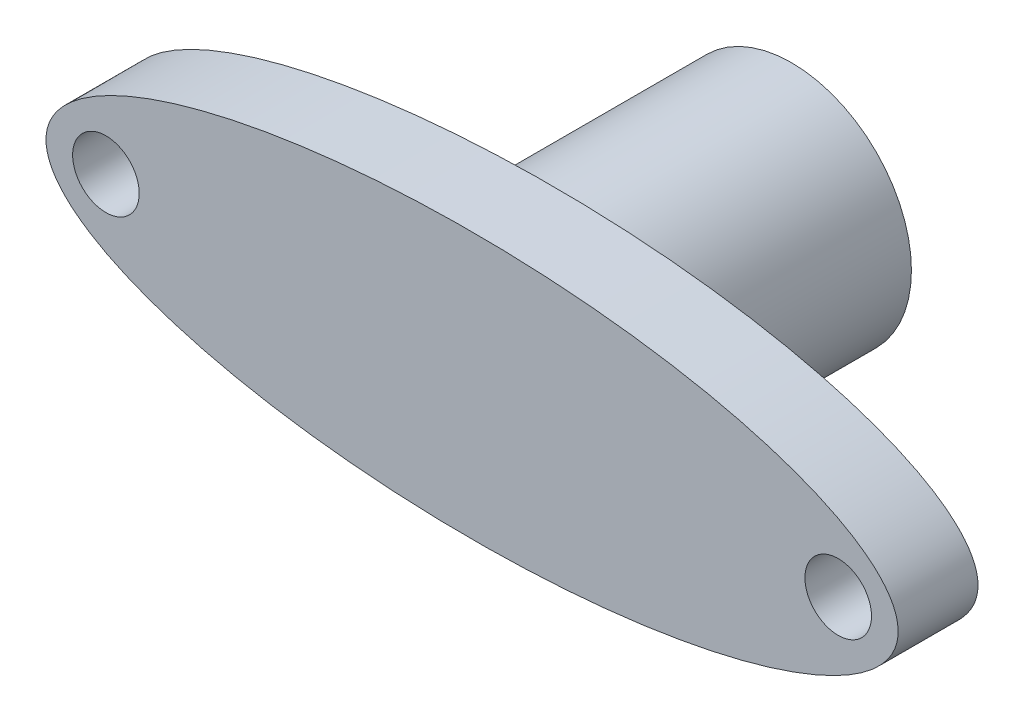
ISO-10303-21;
HEADER;
FILE_DESCRIPTION(('STEP AP214'),'2;1');
FILE_NAME('part.step','',(''),(''),'','','');
FILE_SCHEMA(('AUTOMOTIVE_DESIGN { 1 0 10303 214 1 1 1 1 }'));
ENDSEC;
DATA;
#1=APPLICATION_CONTEXT('core data for automotive mechanical design processes');
#2=APPLICATION_PROTOCOL_DEFINITION('international standard','automotive_design',2000,#1);
#3=PRODUCT_CONTEXT('',#1,'mechanical');
#4=PRODUCT('Part','Part','',(#3));
#5=PRODUCT_RELATED_PRODUCT_CATEGORY('part','',(#4));
#6=PRODUCT_DEFINITION_FORMATION('','',#4);
#7=PRODUCT_DEFINITION_CONTEXT('part definition',#1,'design');
#8=PRODUCT_DEFINITION('design','',#6,#7);
#9=PRODUCT_DEFINITION_SHAPE('','',#8);
#10=(LENGTH_UNIT() NAMED_UNIT(*) SI_UNIT(.MILLI.,.METRE.));
#11=(NAMED_UNIT(*) PLANE_ANGLE_UNIT() SI_UNIT($,.RADIAN.));
#12=(NAMED_UNIT(*) SI_UNIT($,.STERADIAN.) SOLID_ANGLE_UNIT());
#13=UNCERTAINTY_MEASURE_WITH_UNIT(LENGTH_MEASURE(1.E-05),#10,'distance_accuracy_value','');
#14=(GEOMETRIC_REPRESENTATION_CONTEXT(3) GLOBAL_UNCERTAINTY_ASSIGNED_CONTEXT((#13)) GLOBAL_UNIT_ASSIGNED_CONTEXT((#10,
#11,#12)) REPRESENTATION_CONTEXT('',''));
#15=CARTESIAN_POINT('',(0.,0.,0.));
#16=DIRECTION('',(0.,0.,1.));
#17=DIRECTION('',(1.,0.,0.));
#18=AXIS2_PLACEMENT_3D('',#15,#16,#17);
#19=CARTESIAN_POINT('',(-931.832148187907,736.166079396278,0.));
#20=DIRECTION('',(0.,0.,1.));
#21=DIRECTION('',(1.,0.,0.));
#22=AXIS2_PLACEMENT_3D('',#19,#20,#21);
#23=PLANE('',#22);
#24=CARTESIAN_POINT('',(-931.832148187907,736.166079396278,0.));
#25=DIRECTION('',(0.,0.,1.));
#26=DIRECTION('',(1.,0.,0.));
#27=AXIS2_PLACEMENT_3D('',#24,#25,#26);
#28=CIRCLE('',#27,225.);
#29=CARTESIAN_POINT('',(-706.832148187907,736.166079396278,0.));
#30=VERTEX_POINT('',#29);
#31=EDGE_CURVE('E12',#30,#30,#28,.F.);
#32=ORIENTED_EDGE('',*,*,#31,.F.);
#33=EDGE_LOOP('',(#32));
#34=FACE_BOUND('',#33,.T.);
#35=CARTESIAN_POINT('',(-244.332148187907,736.166079396278,0.));
#36=DIRECTION('',(0.,0.,1.));
#37=DIRECTION('',(1.,0.,0.));
#38=AXIS2_PLACEMENT_3D('',#35,#36,#37);
#39=CIRCLE('',#38,62.5);
#40=CARTESIAN_POINT('',(-181.832148187907,736.166079396278,0.));
#41=VERTEX_POINT('',#40);
#42=EDGE_CURVE('E163',#41,#41,#39,.T.);
#43=ORIENTED_EDGE('',*,*,#42,.T.);
#44=EDGE_LOOP('',(#43));
#45=FACE_BOUND('',#44,.T.);
#46=CARTESIAN_POINT('',(-1619.33214818791,736.166079396278,0.));
#47=DIRECTION('',(0.,0.,1.));
#48=DIRECTION('',(1.,0.,0.));
#49=AXIS2_PLACEMENT_3D('',#46,#47,#48);
#50=CIRCLE('',#49,62.5);
#51=CARTESIAN_POINT('',(-1556.83214818791,736.166079396278,0.));
#52=VERTEX_POINT('',#51);
#53=EDGE_CURVE('E169',#52,#52,#50,.T.);
#54=ORIENTED_EDGE('',*,*,#53,.T.);
#55=EDGE_LOOP('',(#54));
#56=FACE_BOUND('',#55,.T.);
#57=CARTESIAN_POINT('',(-931.832148187907,736.166079396278,0.));
#58=DIRECTION('',(0.,0.,1.));
#59=DIRECTION('',(1.,0.,0.));
#60=AXIS2_PLACEMENT_3D('',#57,#58,#59);
#61=ELLIPSE('',#60,800.,250.);
#62=CARTESIAN_POINT('',(-131.832148187907,736.166079396278,0.));
#63=VERTEX_POINT('',#62);
#64=EDGE_CURVE('E172',#63,#63,#61,.T.);
#65=ORIENTED_EDGE('',*,*,#64,.F.);
#66=EDGE_LOOP('',(#65));
#67=FACE_BOUND('',#66,.T.);
#68=ADVANCED_FACE('F52',(#34,#45,#56,#67),#23,.F.);
#69=CARTESIAN_POINT('',(-931.832148187907,736.166079396278,150.));
#70=DIRECTION('',(0.,0.,1.));
#71=DIRECTION('',(1.,0.,0.));
#72=AXIS2_PLACEMENT_3D('',#69,#70,#71);
#73=PLANE('',#72);
#74=CARTESIAN_POINT('',(-1619.33214818791,736.166079396278,150.));
#75=DIRECTION('',(0.,0.,1.));
#76=DIRECTION('',(1.,0.,0.));
#77=AXIS2_PLACEMENT_3D('',#74,#75,#76);
#78=CIRCLE('',#77,62.5);
#79=CARTESIAN_POINT('',(-1556.83214818791,736.166079396278,150.));
#80=VERTEX_POINT('',#79);
#81=EDGE_CURVE('E173',#80,#80,#78,.T.);
#82=ORIENTED_EDGE('',*,*,#81,.F.);
#83=EDGE_LOOP('',(#82));
#84=FACE_BOUND('',#83,.T.);
#85=CARTESIAN_POINT('',(-931.832148187907,736.166079396278,150.));
#86=DIRECTION('',(0.,0.,1.));
#87=DIRECTION('',(1.,0.,0.));
#88=AXIS2_PLACEMENT_3D('',#85,#86,#87);
#89=ELLIPSE('',#88,800.,250.);
#90=CARTESIAN_POINT('',(-131.832148187907,736.166079396278,150.));
#91=VERTEX_POINT('',#90);
#92=EDGE_CURVE('E65',#91,#91,#89,.T.);
#93=ORIENTED_EDGE('',*,*,#92,.T.);
#94=EDGE_LOOP('',(#93));
#95=FACE_BOUND('',#94,.T.);
#96=CARTESIAN_POINT('',(-244.332148187907,736.166079396278,150.));
#97=DIRECTION('',(0.,0.,1.));
#98=DIRECTION('',(1.,0.,0.));
#99=AXIS2_PLACEMENT_3D('',#96,#97,#98);
#100=CIRCLE('',#99,62.5);
#101=CARTESIAN_POINT('',(-181.832148187907,736.166079396278,150.));
#102=VERTEX_POINT('',#101);
#103=EDGE_CURVE('E164',#102,#102,#100,.T.);
#104=ORIENTED_EDGE('',*,*,#103,.F.);
#105=EDGE_LOOP('',(#104));
#106=FACE_BOUND('',#105,.T.);
#107=ADVANCED_FACE('F181',(#84,#95,#106),#73,.T.);
#108=DIRECTION('',(0.,0.,-1.));
#109=VECTOR('',#108,1.);
#110=SURFACE_OF_LINEAR_EXTRUSION('',#89,#109);
#111=ORIENTED_EDGE('',*,*,#92,.F.);
#112=EDGE_LOOP('',(#111));
#113=FACE_BOUND('',#112,.T.);
#114=ORIENTED_EDGE('',*,*,#64,.T.);
#115=EDGE_LOOP('',(#114));
#116=FACE_BOUND('',#115,.T.);
#117=ADVANCED_FACE('F54',(#113,#116),#110,.F.);
#118=CARTESIAN_POINT('',(-1619.33214818791,736.166079396278,150.));
#119=DIRECTION('',(0.,0.,-1.));
#120=DIRECTION('',(-1.,0.,0.));
#121=AXIS2_PLACEMENT_3D('',#118,#119,#120);
#122=CYLINDRICAL_SURFACE('',#121,62.5);
#123=ORIENTED_EDGE('',*,*,#81,.T.);
#124=EDGE_LOOP('',(#123));
#125=FACE_BOUND('',#124,.T.);
#126=ORIENTED_EDGE('',*,*,#53,.F.);
#127=EDGE_LOOP('',(#126));
#128=FACE_BOUND('',#127,.T.);
#129=ADVANCED_FACE('F193',(#125,#128),#122,.F.);
#130=CARTESIAN_POINT('',(-244.332148187907,736.166079396278,150.));
#131=DIRECTION('',(0.,0.,-1.));
#132=DIRECTION('',(-1.,0.,0.));
#133=AXIS2_PLACEMENT_3D('',#130,#131,#132);
#134=CYLINDRICAL_SURFACE('',#133,62.5);
#135=ORIENTED_EDGE('',*,*,#103,.T.);
#136=EDGE_LOOP('',(#135));
#137=FACE_BOUND('',#136,.T.);
#138=ORIENTED_EDGE('',*,*,#42,.F.);
#139=EDGE_LOOP('',(#138));
#140=FACE_BOUND('',#139,.T.);
#141=ADVANCED_FACE('F196',(#137,#140),#134,.F.);
#142=CARTESIAN_POINT('',(-872.915714979078,633.728792189088,-450.));
#143=DIRECTION('',(0.00165450604300018,0.99999863130394,0.));
#144=DIRECTION('',(-0.99999863130394,0.00165450604300018,0.));
#145=AXIS2_PLACEMENT_3D('',#142,#143,#144);
#146=PLANE('',#145);
#147=DIRECTION('',(-0.99999863130394,0.0016545060429936,0.));
#148=VECTOR('',#147,1.);
#149=CARTESIAN_POINT('',(-872.915714979077,633.728792189089,-150.));
#150=LINE('',#149,#148);
#151=CARTESIAN_POINT('',(-872.915714979077,633.728792189089,-150.));
#152=VERTEX_POINT('',#151);
#153=CARTESIAN_POINT('',(-991.087224599681,633.924307933468,-150.));
#154=VERTEX_POINT('',#153);
#155=EDGE_CURVE('E149',#152,#154,#150,.T.);
#156=ORIENTED_EDGE('',*,*,#155,.F.);
#157=DIRECTION('',(0.,0.,1.));
#158=VECTOR('',#157,1.);
#159=CARTESIAN_POINT('',(-872.915714979078,633.728792189088,-450.));
#160=LINE('',#159,#158);
#161=CARTESIAN_POINT('',(-872.915714979078,633.728792189088,-450.));
#162=VERTEX_POINT('',#161);
#163=EDGE_CURVE('E66',#162,#152,#160,.T.);
#164=ORIENTED_EDGE('',*,*,#163,.F.);
#165=DIRECTION('',(-0.99999863130394,0.00165450604300018,0.));
#166=VECTOR('',#165,1.);
#167=CARTESIAN_POINT('',(-872.915714979078,633.728792189088,-450.));
#168=LINE('',#167,#166);
#169=CARTESIAN_POINT('',(-991.087224599681,633.924307933468,-450.));
#170=VERTEX_POINT('',#169);
#171=EDGE_CURVE('E107',#162,#170,#168,.T.);
#172=ORIENTED_EDGE('',*,*,#171,.T.);
#173=DIRECTION('',(0.,0.,1.));
#174=VECTOR('',#173,1.);
#175=CARTESIAN_POINT('',(-991.087224599681,633.924307933468,-450.));
#176=LINE('',#175,#174);
#177=EDGE_CURVE('E109',#170,#154,#176,.T.);
#178=ORIENTED_EDGE('',*,*,#177,.T.);
#179=EDGE_LOOP('',(#156,#164,#172,#178));
#180=FACE_BOUND('',#179,.T.);
#181=ADVANCED_FACE('F108',(#180),#146,.T.);
#182=CARTESIAN_POINT('',(-991.087224599681,633.924307933468,-450.));
#183=DIRECTION('',(0.866851471480381,0.498566471388017,0.));
#184=DIRECTION('',(-0.498566471388017,0.866851471480381,0.));
#185=AXIS2_PLACEMENT_3D('',#182,#183,#184);
#186=PLANE('',#185);
#187=DIRECTION('',(-0.498566471388022,0.866851471480378,0.));
#188=VECTOR('',#187,1.);
#189=CARTESIAN_POINT('',(-991.08722459968,633.924307933467,-150.));
#190=LINE('',#189,#188);
#191=CARTESIAN_POINT('',(-1050.00365780851,736.361595140657,-150.));
#192=VERTEX_POINT('',#191);
#193=EDGE_CURVE('E80',#154,#192,#190,.T.);
#194=ORIENTED_EDGE('',*,*,#193,.F.);
#195=ORIENTED_EDGE('',*,*,#177,.F.);
#196=DIRECTION('',(-0.498566471388017,0.866851471480381,0.));
#197=VECTOR('',#196,1.);
#198=CARTESIAN_POINT('',(-991.087224599681,633.924307933468,-450.));
#199=LINE('',#198,#197);
#200=CARTESIAN_POINT('',(-1050.00365780851,736.361595140657,-450.));
#201=VERTEX_POINT('',#200);
#202=EDGE_CURVE('E113',#170,#201,#199,.T.);
#203=ORIENTED_EDGE('',*,*,#202,.T.);
#204=DIRECTION('',(0.,0.,1.));
#205=VECTOR('',#204,1.);
#206=CARTESIAN_POINT('',(-1050.00365780851,736.361595140657,-450.));
#207=LINE('',#206,#205);
#208=EDGE_CURVE('E119',#201,#192,#207,.T.);
#209=ORIENTED_EDGE('',*,*,#208,.T.);
#210=EDGE_LOOP('',(#194,#195,#203,#209));
#211=FACE_BOUND('',#210,.T.);
#212=ADVANCED_FACE('F120',(#211),#186,.T.);
#213=CARTESIAN_POINT('',(-1050.00365780851,736.361595140657,-450.));
#214=DIRECTION('',(0.865196965437382,-0.501432159915921,0.));
#215=DIRECTION('',(0.501432159915921,0.865196965437382,0.));
#216=AXIS2_PLACEMENT_3D('',#213,#214,#215);
#217=PLANE('',#216);
#218=DIRECTION('',(0.501432159915916,0.865196965437385,0.));
#219=VECTOR('',#218,1.);
#220=CARTESIAN_POINT('',(-1050.00365780851,736.361595140656,-150.));
#221=LINE('',#220,#219);
#222=CARTESIAN_POINT('',(-990.748581396736,838.603366603467,-150.));
#223=VERTEX_POINT('',#222);
#224=EDGE_CURVE('E155',#192,#223,#221,.T.);
#225=ORIENTED_EDGE('',*,*,#224,.F.);
#226=ORIENTED_EDGE('',*,*,#208,.F.);
#227=DIRECTION('',(0.501432159915921,0.865196965437381,0.));
#228=VECTOR('',#227,1.);
#229=CARTESIAN_POINT('',(-1050.00365780851,736.361595140657,-450.));
#230=LINE('',#229,#228);
#231=CARTESIAN_POINT('',(-990.748581396736,838.603366603467,-450.));
#232=VERTEX_POINT('',#231);
#233=EDGE_CURVE('E123',#201,#232,#230,.T.);
#234=ORIENTED_EDGE('',*,*,#233,.T.);
#235=DIRECTION('',(0.,0.,1.));
#236=VECTOR('',#235,1.);
#237=CARTESIAN_POINT('',(-990.748581396736,838.603366603467,-450.));
#238=LINE('',#237,#236);
#239=EDGE_CURVE('E141',#232,#223,#238,.T.);
#240=ORIENTED_EDGE('',*,*,#239,.T.);
#241=EDGE_LOOP('',(#225,#226,#234,#240));
#242=FACE_BOUND('',#241,.T.);
#243=ADVANCED_FACE('F220',(#242),#217,.T.);
#244=CARTESIAN_POINT('',(-990.748581396736,838.603366603467,-450.));
#245=DIRECTION('',(-0.00165450604299923,-0.99999863130394,0.));
#246=DIRECTION('',(0.99999863130394,-0.00165450604299923,0.));
#247=AXIS2_PLACEMENT_3D('',#244,#245,#246);
#248=PLANE('',#247);
#249=DIRECTION('',(0.99999863130394,-0.0016545060429936,0.));
#250=VECTOR('',#249,1.);
#251=CARTESIAN_POINT('',(-990.748581396737,838.603366603467,-150.));
#252=LINE('',#251,#250);
#253=CARTESIAN_POINT('',(-872.577071776133,838.407850859088,-150.));
#254=VERTEX_POINT('',#253);
#255=EDGE_CURVE('E154',#223,#254,#252,.T.);
#256=ORIENTED_EDGE('',*,*,#255,.F.);
#257=ORIENTED_EDGE('',*,*,#239,.F.);
#258=DIRECTION('',(0.99999863130394,-0.00165450604299923,0.));
#259=VECTOR('',#258,1.);
#260=CARTESIAN_POINT('',(-990.748581396736,838.603366603467,-450.));
#261=LINE('',#260,#259);
#262=CARTESIAN_POINT('',(-872.577071776133,838.407850859088,-450.));
#263=VERTEX_POINT('',#262);
#264=EDGE_CURVE('E130',#232,#263,#261,.T.);
#265=ORIENTED_EDGE('',*,*,#264,.T.);
#266=DIRECTION('',(0.,0.,1.));
#267=VECTOR('',#266,1.);
#268=CARTESIAN_POINT('',(-872.577071776133,838.407850859088,-450.));
#269=LINE('',#268,#267);
#270=EDGE_CURVE('E138',#263,#254,#269,.T.);
#271=ORIENTED_EDGE('',*,*,#270,.T.);
#272=EDGE_LOOP('',(#256,#257,#265,#271));
#273=FACE_BOUND('',#272,.T.);
#274=ADVANCED_FACE('F219',(#273),#248,.T.);
#275=CARTESIAN_POINT('',(-872.577071776133,838.407850859088,-450.));
#276=DIRECTION('',(-0.866851471480381,-0.498566471388017,0.));
#277=DIRECTION('',(0.498566471388017,-0.866851471480381,0.));
#278=AXIS2_PLACEMENT_3D('',#275,#276,#277);
#279=PLANE('',#278);
#280=DIRECTION('',(0.498566471388022,-0.866851471480378,0.));
#281=VECTOR('',#280,1.);
#282=CARTESIAN_POINT('',(-872.577071776133,838.407850859089,-150.));
#283=LINE('',#282,#281);
#284=CARTESIAN_POINT('',(-813.660638567303,735.970563651898,-150.));
#285=VERTEX_POINT('',#284);
#286=EDGE_CURVE('E158',#254,#285,#283,.T.);
#287=ORIENTED_EDGE('',*,*,#286,.F.);
#288=ORIENTED_EDGE('',*,*,#270,.F.);
#289=DIRECTION('',(0.498566471388017,-0.866851471480381,0.));
#290=VECTOR('',#289,1.);
#291=CARTESIAN_POINT('',(-872.577071776133,838.407850859088,-450.));
#292=LINE('',#291,#290);
#293=CARTESIAN_POINT('',(-813.660638567303,735.970563651898,-450.));
#294=VERTEX_POINT('',#293);
#295=EDGE_CURVE('E133',#263,#294,#292,.T.);
#296=ORIENTED_EDGE('',*,*,#295,.T.);
#297=DIRECTION('',(0.,0.,1.));
#298=VECTOR('',#297,1.);
#299=CARTESIAN_POINT('',(-813.660638567303,735.970563651898,-450.));
#300=LINE('',#299,#298);
#301=EDGE_CURVE('E140',#294,#285,#300,.T.);
#302=ORIENTED_EDGE('',*,*,#301,.T.);
#303=EDGE_LOOP('',(#287,#288,#296,#302));
#304=FACE_BOUND('',#303,.T.);
#305=ADVANCED_FACE('F221',(#304),#279,.T.);
#306=CARTESIAN_POINT('',(-813.660638567303,735.970563651898,-450.));
#307=DIRECTION('',(-0.865196965437381,0.501432159915923,0.));
#308=DIRECTION('',(-0.501432159915923,-0.865196965437381,0.));
#309=AXIS2_PLACEMENT_3D('',#306,#307,#308);
#310=PLANE('',#309);
#311=DIRECTION('',(-0.501432159915919,-0.865196965437383,0.));
#312=VECTOR('',#311,1.);
#313=CARTESIAN_POINT('',(-813.660638567303,735.970563651899,-150.));
#314=LINE('',#313,#312);
#315=EDGE_CURVE('E161',#285,#152,#314,.T.);
#316=ORIENTED_EDGE('',*,*,#315,.F.);
#317=ORIENTED_EDGE('',*,*,#301,.F.);
#318=DIRECTION('',(-0.501432159915923,-0.865196965437381,0.));
#319=VECTOR('',#318,1.);
#320=CARTESIAN_POINT('',(-813.660638567303,735.970563651898,-450.));
#321=LINE('',#320,#319);
#322=EDGE_CURVE('E132',#294,#162,#321,.T.);
#323=ORIENTED_EDGE('',*,*,#322,.T.);
#324=ORIENTED_EDGE('',*,*,#163,.T.);
#325=EDGE_LOOP('',(#316,#317,#323,#324));
#326=FACE_BOUND('',#325,.T.);
#327=ADVANCED_FACE('F215',(#326),#310,.T.);
#328=CARTESIAN_POINT('',(-931.832148187907,736.166079396278,-450.));
#329=DIRECTION('',(0.,0.,-1.));
#330=DIRECTION('',(-1.,0.,0.));
#331=AXIS2_PLACEMENT_3D('',#328,#329,#330);
#332=PLANE('',#331);
#333=CARTESIAN_POINT('',(-931.832148187907,736.166079396278,-450.));
#334=DIRECTION('',(0.,0.,-1.));
#335=DIRECTION('',(-1.,0.,0.));
#336=AXIS2_PLACEMENT_3D('',#333,#334,#335);
#337=CIRCLE('',#336,225.);
#338=CARTESIAN_POINT('',(-1156.83214818791,736.166079396278,-450.));
#339=VERTEX_POINT('',#338);
#340=EDGE_CURVE('E117',#339,#339,#337,.T.);
#341=ORIENTED_EDGE('',*,*,#340,.T.);
#342=EDGE_LOOP('',(#341));
#343=FACE_BOUND('',#342,.T.);
#344=ORIENTED_EDGE('',*,*,#202,.F.);
#345=ORIENTED_EDGE('',*,*,#171,.F.);
#346=ORIENTED_EDGE('',*,*,#322,.F.);
#347=ORIENTED_EDGE('',*,*,#295,.F.);
#348=ORIENTED_EDGE('',*,*,#264,.F.);
#349=ORIENTED_EDGE('',*,*,#233,.F.);
#350=EDGE_LOOP('',(#344,#345,#346,#347,#348,#349));
#351=FACE_BOUND('',#350,.T.);
#352=ADVANCED_FACE('F124',(#343,#351),#332,.T.);
#353=CARTESIAN_POINT('',(-931.832148187907,736.166079396278,-450.));
#354=DIRECTION('',(0.,0.,1.));
#355=DIRECTION('',(1.,0.,0.));
#356=AXIS2_PLACEMENT_3D('',#353,#354,#355);
#357=CYLINDRICAL_SURFACE('',#356,225.);
#358=ORIENTED_EDGE('',*,*,#340,.F.);
#359=EDGE_LOOP('',(#358));
#360=FACE_BOUND('',#359,.T.);
#361=ORIENTED_EDGE('',*,*,#31,.T.);
#362=EDGE_LOOP('',(#361));
#363=FACE_BOUND('',#362,.T.);
#364=ADVANCED_FACE('F202',(#360,#363),#357,.T.);
#365=CARTESIAN_POINT('',(0.,0.,-150.));
#366=DIRECTION('',(0.,0.,-1.));
#367=DIRECTION('',(-1.,0.,0.));
#368=AXIS2_PLACEMENT_3D('',#365,#366,#367);
#369=PLANE('',#368);
#370=ORIENTED_EDGE('',*,*,#155,.T.);
#371=ORIENTED_EDGE('',*,*,#193,.T.);
#372=ORIENTED_EDGE('',*,*,#224,.T.);
#373=ORIENTED_EDGE('',*,*,#255,.T.);
#374=ORIENTED_EDGE('',*,*,#286,.T.);
#375=ORIENTED_EDGE('',*,*,#315,.T.);
#376=EDGE_LOOP('',(#370,#371,#372,#373,#374,#375));
#377=FACE_BOUND('',#376,.T.);
#378=ADVANCED_FACE('F205',(#377),#369,.T.);
#379=CLOSED_SHELL('',(#68,#107,#117,#129,#141,#181,#212,#243,#274,#305,#327,#352,#364,#378));
#380=MANIFOLD_SOLID_BREP('B2',#379);
#381=ADVANCED_BREP_SHAPE_REPRESENTATION('',(#18,#380),#14);
#382=SHAPE_DEFINITION_REPRESENTATION(#9,#381);
ENDSEC;
END-ISO-10303-21;
